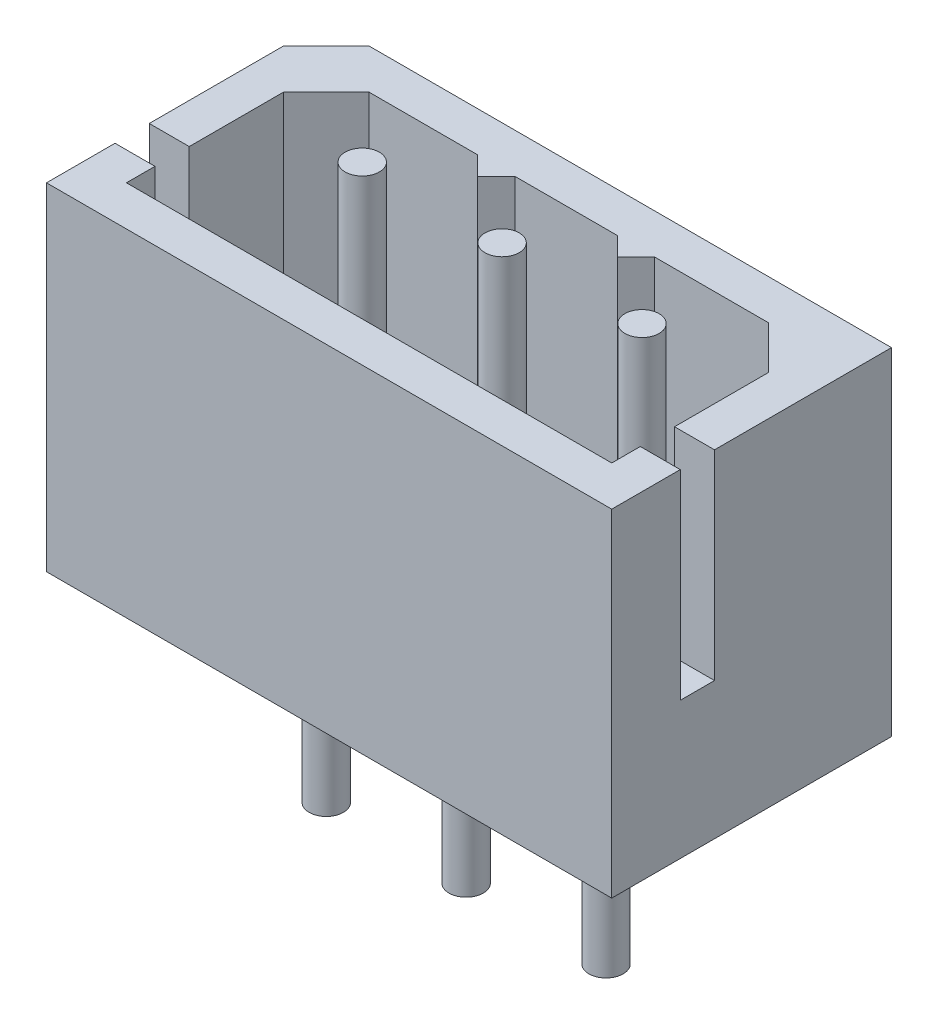
ISO-10303-21;
HEADER;
FILE_DESCRIPTION(('STEP AP214'),'2;1');
FILE_NAME('part.step','',(''),(''),'','','');
FILE_SCHEMA(('AUTOMOTIVE_DESIGN { 1 0 10303 214 1 1 1 1 }'));
ENDSEC;
DATA;
#1=APPLICATION_CONTEXT('core data for automotive mechanical design processes');
#2=APPLICATION_PROTOCOL_DEFINITION('international standard','automotive_design',2000,#1);
#3=PRODUCT_CONTEXT('',#1,'mechanical');
#4=PRODUCT('Part','Part','',(#3));
#5=PRODUCT_RELATED_PRODUCT_CATEGORY('part','',(#4));
#6=PRODUCT_DEFINITION_FORMATION('','',#4);
#7=PRODUCT_DEFINITION_CONTEXT('part definition',#1,'design');
#8=PRODUCT_DEFINITION('design','',#6,#7);
#9=PRODUCT_DEFINITION_SHAPE('','',#8);
#10=(LENGTH_UNIT() NAMED_UNIT(*) SI_UNIT(.MILLI.,.METRE.));
#11=(NAMED_UNIT(*) PLANE_ANGLE_UNIT() SI_UNIT($,.RADIAN.));
#12=(NAMED_UNIT(*) SI_UNIT($,.STERADIAN.) SOLID_ANGLE_UNIT());
#13=UNCERTAINTY_MEASURE_WITH_UNIT(LENGTH_MEASURE(1.E-05),#10,'distance_accuracy_value','');
#14=(GEOMETRIC_REPRESENTATION_CONTEXT(3) GLOBAL_UNCERTAINTY_ASSIGNED_CONTEXT((#13)) GLOBAL_UNIT_ASSIGNED_CONTEXT((#10,
#11,#12)) REPRESENTATION_CONTEXT('',''));
#15=CARTESIAN_POINT('',(0.,0.,0.));
#16=DIRECTION('',(0.,0.,1.));
#17=DIRECTION('',(1.,0.,0.));
#18=AXIS2_PLACEMENT_3D('',#15,#16,#17);
#19=CARTESIAN_POINT('',(-4.95,-5.9,-1.7));
#20=DIRECTION('',(-1.,0.,0.));
#21=DIRECTION('',(0.,0.,1.));
#22=AXIS2_PLACEMENT_3D('',#19,#20,#21);
#23=PLANE('',#22);
#24=DIRECTION('',(0.,0.,1.));
#25=VECTOR('',#24,1.);
#26=CARTESIAN_POINT('',(-4.95,0.,-1.7));
#27=LINE('',#26,#25);
#28=CARTESIAN_POINT('',(-4.95,0.,1.25));
#29=VERTEX_POINT('',#28);
#30=CARTESIAN_POINT('',(-4.95,0.,2.45));
#31=VERTEX_POINT('',#30);
#32=EDGE_CURVE('E139',#29,#31,#27,.T.);
#33=ORIENTED_EDGE('',*,*,#32,.F.);
#34=DIRECTION('',(0.,1.,0.));
#35=VECTOR('',#34,1.);
#36=CARTESIAN_POINT('',(-4.95,-3.5,1.25));
#37=LINE('',#36,#35);
#38=CARTESIAN_POINT('',(-4.95,-3.5,1.25));
#39=VERTEX_POINT('',#38);
#40=EDGE_CURVE('E251',#39,#29,#37,.T.);
#41=ORIENTED_EDGE('',*,*,#40,.F.);
#42=DIRECTION('',(0.,0.,1.));
#43=VECTOR('',#42,1.);
#44=CARTESIAN_POINT('',(-4.95,-3.5,0.));
#45=LINE('',#44,#43);
#46=CARTESIAN_POINT('',(-4.95,-3.5,0.65));
#47=VERTEX_POINT('',#46);
#48=EDGE_CURVE('E324',#47,#39,#45,.T.);
#49=ORIENTED_EDGE('',*,*,#48,.F.);
#50=DIRECTION('',(0.,1.,0.));
#51=VECTOR('',#50,1.);
#52=CARTESIAN_POINT('',(-4.95,-3.5,0.65));
#53=LINE('',#52,#51);
#54=CARTESIAN_POINT('',(-4.95,0.,0.65));
#55=VERTEX_POINT('',#54);
#56=EDGE_CURVE('E249',#47,#55,#53,.T.);
#57=ORIENTED_EDGE('',*,*,#56,.T.);
#58=CARTESIAN_POINT('',(-4.95,0.,-1.7));
#59=VERTEX_POINT('',#58);
#60=EDGE_CURVE('E107',#59,#55,#27,.T.);
#61=ORIENTED_EDGE('',*,*,#60,.F.);
#62=DIRECTION('',(0.,1.,0.));
#63=VECTOR('',#62,1.);
#64=CARTESIAN_POINT('',(-4.95,-5.9,-1.7));
#65=LINE('',#64,#63);
#66=CARTESIAN_POINT('',(-4.95,-5.9,-1.7));
#67=VERTEX_POINT('',#66);
#68=EDGE_CURVE('E99',#67,#59,#65,.T.);
#69=ORIENTED_EDGE('',*,*,#68,.F.);
#70=DIRECTION('',(0.,0.,1.));
#71=VECTOR('',#70,1.);
#72=CARTESIAN_POINT('',(-4.95,-5.9,-1.7));
#73=LINE('',#72,#71);
#74=CARTESIAN_POINT('',(-4.95,-5.9,2.45));
#75=VERTEX_POINT('',#74);
#76=EDGE_CURVE('E103',#67,#75,#73,.T.);
#77=ORIENTED_EDGE('',*,*,#76,.T.);
#78=DIRECTION('',(0.,1.,0.));
#79=VECTOR('',#78,1.);
#80=CARTESIAN_POINT('',(-4.95,-5.9,2.45));
#81=LINE('',#80,#79);
#82=EDGE_CURVE('E112',#75,#31,#81,.T.);
#83=ORIENTED_EDGE('',*,*,#82,.T.);
#84=EDGE_LOOP('',(#33,#41,#49,#57,#61,#69,#77,#83));
#85=FACE_BOUND('',#84,.T.);
#86=ADVANCED_FACE('F33',(#85),#23,.T.);
#87=CARTESIAN_POINT('',(0.,0.,0.));
#88=DIRECTION('',(0.,1.,0.));
#89=DIRECTION('',(0.,0.,1.));
#90=AXIS2_PLACEMENT_3D('',#87,#88,#89);
#91=PLANE('',#90);
#92=ORIENTED_EDGE('',*,*,#60,.T.);
#93=DIRECTION('',(1.,0.,0.));
#94=VECTOR('',#93,1.);
#95=CARTESIAN_POINT('',(0.,0.,0.649999999999981));
#96=LINE('',#95,#94);
#97=CARTESIAN_POINT('',(-4.25,0.,0.649999999999997));
#98=VERTEX_POINT('',#97);
#99=EDGE_CURVE('E271',#55,#98,#96,.T.);
#100=ORIENTED_EDGE('',*,*,#99,.T.);
#101=DIRECTION('',(0.,0.,1.));
#102=VECTOR('',#101,1.);
#103=CARTESIAN_POINT('',(-4.25,0.,0.));
#104=LINE('',#103,#102);
#105=CARTESIAN_POINT('',(-4.25,0.,-0.999999999999997));
#106=VERTEX_POINT('',#105);
#107=EDGE_CURVE('E274',#106,#98,#104,.T.);
#108=ORIENTED_EDGE('',*,*,#107,.F.);
#109=DIRECTION('',(-0.707106781186547,0.,0.707106781186548));
#110=VECTOR('',#109,1.);
#111=CARTESIAN_POINT('',(-2.625,0.,-2.625));
#112=LINE('',#111,#110);
#113=CARTESIAN_POINT('',(-3.5,0.,-1.75));
#114=VERTEX_POINT('',#113);
#115=EDGE_CURVE('E277',#114,#106,#112,.T.);
#116=ORIENTED_EDGE('',*,*,#115,.F.);
#117=DIRECTION('',(1.,0.,0.));
#118=VECTOR('',#117,1.);
#119=CARTESIAN_POINT('',(0.,0.,-1.75));
#120=LINE('',#119,#118);
#121=CARTESIAN_POINT('',(-1.60324749587586,0.,-1.75));
#122=VERTEX_POINT('',#121);
#123=EDGE_CURVE('E280',#114,#122,#120,.T.);
#124=ORIENTED_EDGE('',*,*,#123,.T.);
#125=DIRECTION('',(-0.707106781186551,0.,-0.707106781186544));
#126=VECTOR('',#125,1.);
#127=CARTESIAN_POINT('',(0.0733762520620777,0.,-0.0733762520620785));
#128=LINE('',#127,#126);
#129=CARTESIAN_POINT('',(-1.27500000000001,0.,-1.42175250412415));
#130=VERTEX_POINT('',#129);
#131=EDGE_CURVE('E281',#130,#122,#128,.T.);
#132=ORIENTED_EDGE('',*,*,#131,.F.);
#133=DIRECTION('',(0.707106781186546,0.,-0.707106781186549));
#134=VECTOR('',#133,1.);
#135=CARTESIAN_POINT('',(-1.34837625206208,0.,-1.34837625206207));
#136=LINE('',#135,#134);
#137=CARTESIAN_POINT('',(-0.946752504124156,0.,-1.75));
#138=VERTEX_POINT('',#137);
#139=EDGE_CURVE('E284',#130,#138,#136,.T.);
#140=ORIENTED_EDGE('',*,*,#139,.T.);
#141=CARTESIAN_POINT('',(0.846752504124141,0.,-1.75));
#142=VERTEX_POINT('',#141);
#143=EDGE_CURVE('E287',#138,#142,#120,.T.);
#144=ORIENTED_EDGE('',*,*,#143,.T.);
#145=DIRECTION('',(-0.707106781186551,0.,-0.707106781186544));
#146=VECTOR('',#145,1.);
#147=CARTESIAN_POINT('',(1.29837625206206,0.,-1.29837625206208));
#148=LINE('',#147,#146);
#149=CARTESIAN_POINT('',(1.175,0.,-1.42175250412415));
#150=VERTEX_POINT('',#149);
#151=EDGE_CURVE('E288',#150,#142,#148,.T.);
#152=ORIENTED_EDGE('',*,*,#151,.F.);
#153=DIRECTION('',(0.707106781186546,0.,-0.707106781186549));
#154=VECTOR('',#153,1.);
#155=CARTESIAN_POINT('',(-0.123376252062073,0.,-0.123376252062072));
#156=LINE('',#155,#154);
#157=CARTESIAN_POINT('',(1.50324749587584,0.,-1.75));
#158=VERTEX_POINT('',#157);
#159=EDGE_CURVE('E291',#150,#158,#156,.T.);
#160=ORIENTED_EDGE('',*,*,#159,.T.);
#161=CARTESIAN_POINT('',(3.5,0.,-1.75));
#162=VERTEX_POINT('',#161);
#163=EDGE_CURVE('E294',#158,#162,#120,.T.);
#164=ORIENTED_EDGE('',*,*,#163,.T.);
#165=DIRECTION('',(0.707106781186548,0.,0.707106781186547));
#166=VECTOR('',#165,1.);
#167=CARTESIAN_POINT('',(2.625,0.,-2.625));
#168=LINE('',#167,#166);
#169=CARTESIAN_POINT('',(4.25,0.,-0.999999999999997));
#170=VERTEX_POINT('',#169);
#171=EDGE_CURVE('E297',#162,#170,#168,.T.);
#172=ORIENTED_EDGE('',*,*,#171,.T.);
#173=DIRECTION('',(0.,0.,1.));
#174=VECTOR('',#173,1.);
#175=CARTESIAN_POINT('',(4.25,0.,0.));
#176=LINE('',#175,#174);
#177=CARTESIAN_POINT('',(4.25,0.,0.649999999999997));
#178=VERTEX_POINT('',#177);
#179=EDGE_CURVE('E300',#170,#178,#176,.T.);
#180=ORIENTED_EDGE('',*,*,#179,.T.);
#181=DIRECTION('',(-1.,0.,0.));
#182=VECTOR('',#181,1.);
#183=CARTESIAN_POINT('',(0.,0.,0.649999999999995));
#184=LINE('',#183,#182);
#185=CARTESIAN_POINT('',(4.95,0.,0.649999999999998));
#186=VERTEX_POINT('',#185);
#187=EDGE_CURVE('E191',#186,#178,#184,.T.);
#188=ORIENTED_EDGE('',*,*,#187,.F.);
#189=DIRECTION('',(0.,0.,-1.));
#190=VECTOR('',#189,1.);
#191=CARTESIAN_POINT('',(4.95,0.,-2.45));
#192=LINE('',#191,#190);
#193=CARTESIAN_POINT('',(4.95,0.,-2.45));
#194=VERTEX_POINT('',#193);
#195=EDGE_CURVE('E134',#186,#194,#192,.T.);
#196=ORIENTED_EDGE('',*,*,#195,.T.);
#197=DIRECTION('',(-1.,0.,0.));
#198=VECTOR('',#197,1.);
#199=CARTESIAN_POINT('',(-4.2,0.,-2.45));
#200=LINE('',#199,#198);
#201=CARTESIAN_POINT('',(-4.2,0.,-2.45));
#202=VERTEX_POINT('',#201);
#203=EDGE_CURVE('E133',#194,#202,#200,.T.);
#204=ORIENTED_EDGE('',*,*,#203,.T.);
#205=DIRECTION('',(-0.707106781186548,0.,0.707106781186547));
#206=VECTOR('',#205,1.);
#207=CARTESIAN_POINT('',(-4.2,0.,-2.45));
#208=LINE('',#207,#206);
#209=EDGE_CURVE('E137',#202,#59,#208,.T.);
#210=ORIENTED_EDGE('',*,*,#209,.T.);
#211=EDGE_LOOP('',(#92,#100,#108,#116,#124,#132,#140,#144,#152,#160,#164,#172,#180,#188,#196,
#204,#210));
#212=FACE_BOUND('',#211,.T.);
#213=ADVANCED_FACE('F163',(#212),#91,.T.);
#214=DIRECTION('',(0.,0.,1.));
#215=VECTOR('',#214,1.);
#216=CARTESIAN_POINT('',(-4.25000000000001,0.,0.));
#217=LINE('',#216,#215);
#218=CARTESIAN_POINT('',(-4.25,0.,1.25));
#219=VERTEX_POINT('',#218);
#220=CARTESIAN_POINT('',(-4.25,0.,1.75));
#221=VERTEX_POINT('',#220);
#222=EDGE_CURVE('E265',#219,#221,#217,.T.);
#223=ORIENTED_EDGE('',*,*,#222,.F.);
#224=DIRECTION('',(-1.,0.,0.));
#225=VECTOR('',#224,1.);
#226=CARTESIAN_POINT('',(0.,0.,1.24999999999998));
#227=LINE('',#226,#225);
#228=EDGE_CURVE('E268',#219,#29,#227,.T.);
#229=ORIENTED_EDGE('',*,*,#228,.T.);
#230=ORIENTED_EDGE('',*,*,#32,.T.);
#231=DIRECTION('',(1.,0.,0.));
#232=VECTOR('',#231,1.);
#233=CARTESIAN_POINT('',(-4.95,0.,2.45));
#234=LINE('',#233,#232);
#235=CARTESIAN_POINT('',(4.95,0.,2.45));
#236=VERTEX_POINT('',#235);
#237=EDGE_CURVE('E141',#31,#236,#234,.T.);
#238=ORIENTED_EDGE('',*,*,#237,.T.);
#239=CARTESIAN_POINT('',(4.95,0.,1.25));
#240=VERTEX_POINT('',#239);
#241=EDGE_CURVE('E130',#236,#240,#192,.T.);
#242=ORIENTED_EDGE('',*,*,#241,.T.);
#243=DIRECTION('',(1.,0.,0.));
#244=VECTOR('',#243,1.);
#245=CARTESIAN_POINT('',(0.,0.,1.24999999999999));
#246=LINE('',#245,#244);
#247=CARTESIAN_POINT('',(4.25,0.,1.25));
#248=VERTEX_POINT('',#247);
#249=EDGE_CURVE('E303',#248,#240,#246,.T.);
#250=ORIENTED_EDGE('',*,*,#249,.F.);
#251=DIRECTION('',(0.,0.,1.));
#252=VECTOR('',#251,1.);
#253=CARTESIAN_POINT('',(4.25000000000001,0.,0.));
#254=LINE('',#253,#252);
#255=CARTESIAN_POINT('',(4.25,0.,1.75));
#256=VERTEX_POINT('',#255);
#257=EDGE_CURVE('E48',#248,#256,#254,.T.);
#258=ORIENTED_EDGE('',*,*,#257,.T.);
#259=DIRECTION('',(1.,0.,0.));
#260=VECTOR('',#259,1.);
#261=CARTESIAN_POINT('',(0.,0.,1.75));
#262=LINE('',#261,#260);
#263=EDGE_CURVE('E261',#221,#256,#262,.T.);
#264=ORIENTED_EDGE('',*,*,#263,.F.);
#265=EDGE_LOOP('',(#223,#229,#230,#238,#242,#250,#258,#264));
#266=FACE_BOUND('',#265,.T.);
#267=ADVANCED_FACE('F156',(#266),#91,.T.);
#268=CARTESIAN_POINT('',(0.,-5.9,0.));
#269=DIRECTION('',(0.,1.,0.));
#270=DIRECTION('',(0.,0.,1.));
#271=AXIS2_PLACEMENT_3D('',#268,#269,#270);
#272=PLANE('',#271);
#273=CARTESIAN_POINT('',(-0.0500000000000079,-5.9,0.));
#274=DIRECTION('',(0.,1.,0.));
#275=DIRECTION('',(0.,0.,1.));
#276=AXIS2_PLACEMENT_3D('',#273,#274,#275);
#277=CIRCLE('',#276,0.3);
#278=CARTESIAN_POINT('',(-0.0500000000000079,-5.9,0.3));
#279=VERTEX_POINT('',#278);
#280=EDGE_CURVE('E41',#279,#279,#277,.F.);
#281=ORIENTED_EDGE('',*,*,#280,.F.);
#282=EDGE_LOOP('',(#281));
#283=FACE_BOUND('',#282,.T.);
#284=DIRECTION('',(0.,0.,-1.));
#285=VECTOR('',#284,1.);
#286=CARTESIAN_POINT('',(4.95,-5.9,-2.45));
#287=LINE('',#286,#285);
#288=CARTESIAN_POINT('',(4.95,-5.9,2.45));
#289=VERTEX_POINT('',#288);
#290=CARTESIAN_POINT('',(4.95,-5.9,-2.45));
#291=VERTEX_POINT('',#290);
#292=EDGE_CURVE('E125',#289,#291,#287,.T.);
#293=ORIENTED_EDGE('',*,*,#292,.F.);
#294=DIRECTION('',(1.,0.,0.));
#295=VECTOR('',#294,1.);
#296=CARTESIAN_POINT('',(-4.95,-5.9,2.45));
#297=LINE('',#296,#295);
#298=EDGE_CURVE('E120',#75,#289,#297,.T.);
#299=ORIENTED_EDGE('',*,*,#298,.F.);
#300=ORIENTED_EDGE('',*,*,#76,.F.);
#301=DIRECTION('',(-0.707106781186548,0.,0.707106781186547));
#302=VECTOR('',#301,1.);
#303=CARTESIAN_POINT('',(-4.2,-5.9,-2.45));
#304=LINE('',#303,#302);
#305=CARTESIAN_POINT('',(-4.2,-5.9,-2.45));
#306=VERTEX_POINT('',#305);
#307=EDGE_CURVE('E119',#306,#67,#304,.T.);
#308=ORIENTED_EDGE('',*,*,#307,.F.);
#309=DIRECTION('',(-1.,0.,0.));
#310=VECTOR('',#309,1.);
#311=CARTESIAN_POINT('',(-4.2,-5.9,-2.45));
#312=LINE('',#311,#310);
#313=EDGE_CURVE('E123',#291,#306,#312,.T.);
#314=ORIENTED_EDGE('',*,*,#313,.F.);
#315=EDGE_LOOP('',(#293,#299,#300,#308,#314));
#316=FACE_BOUND('',#315,.T.);
#317=CARTESIAN_POINT('',(-2.5,-5.9,0.));
#318=DIRECTION('',(0.,1.,0.));
#319=DIRECTION('',(0.,0.,1.));
#320=AXIS2_PLACEMENT_3D('',#317,#318,#319);
#321=CIRCLE('',#320,0.299999999999992);
#322=CARTESIAN_POINT('',(-2.5,-5.9,0.299999999999992));
#323=VERTEX_POINT('',#322);
#324=EDGE_CURVE('E145',#323,#323,#321,.F.);
#325=ORIENTED_EDGE('',*,*,#324,.F.);
#326=EDGE_LOOP('',(#325));
#327=FACE_BOUND('',#326,.T.);
#328=CARTESIAN_POINT('',(2.39999999999998,-5.9,0.));
#329=DIRECTION('',(0.,1.,0.));
#330=DIRECTION('',(0.,0.,1.));
#331=AXIS2_PLACEMENT_3D('',#328,#329,#330);
#332=CIRCLE('',#331,0.3);
#333=CARTESIAN_POINT('',(2.39999999999998,-5.9,0.3));
#334=VERTEX_POINT('',#333);
#335=EDGE_CURVE('E11',#334,#334,#332,.F.);
#336=ORIENTED_EDGE('',*,*,#335,.F.);
#337=EDGE_LOOP('',(#336));
#338=FACE_BOUND('',#337,.T.);
#339=ADVANCED_FACE('F117',(#283,#316,#327,#338),#272,.F.);
#340=CARTESIAN_POINT('',(4.95,-5.9,-2.45));
#341=DIRECTION('',(1.,0.,0.));
#342=DIRECTION('',(0.,0.,-1.));
#343=AXIS2_PLACEMENT_3D('',#340,#341,#342);
#344=PLANE('',#343);
#345=DIRECTION('',(0.,1.,0.));
#346=VECTOR('',#345,1.);
#347=CARTESIAN_POINT('',(4.95,-3.5,0.649999999999998));
#348=LINE('',#347,#346);
#349=CARTESIAN_POINT('',(4.95,-3.5,0.649999999999998));
#350=VERTEX_POINT('',#349);
#351=EDGE_CURVE('E210',#350,#186,#348,.T.);
#352=ORIENTED_EDGE('',*,*,#351,.F.);
#353=DIRECTION('',(0.,0.,-1.));
#354=VECTOR('',#353,1.);
#355=CARTESIAN_POINT('',(4.95,-3.5,0.));
#356=LINE('',#355,#354);
#357=CARTESIAN_POINT('',(4.95,-3.5,1.25));
#358=VERTEX_POINT('',#357);
#359=EDGE_CURVE('E362',#358,#350,#356,.T.);
#360=ORIENTED_EDGE('',*,*,#359,.F.);
#361=DIRECTION('',(0.,1.,0.));
#362=VECTOR('',#361,1.);
#363=CARTESIAN_POINT('',(4.95,-3.5,1.25));
#364=LINE('',#363,#362);
#365=EDGE_CURVE('E206',#358,#240,#364,.T.);
#366=ORIENTED_EDGE('',*,*,#365,.T.);
#367=ORIENTED_EDGE('',*,*,#241,.F.);
#368=DIRECTION('',(0.,1.,0.));
#369=VECTOR('',#368,1.);
#370=CARTESIAN_POINT('',(4.95,-5.9,2.45));
#371=LINE('',#370,#369);
#372=EDGE_CURVE('E57',#289,#236,#371,.T.);
#373=ORIENTED_EDGE('',*,*,#372,.F.);
#374=ORIENTED_EDGE('',*,*,#292,.T.);
#375=DIRECTION('',(0.,1.,0.));
#376=VECTOR('',#375,1.);
#377=CARTESIAN_POINT('',(4.95,-5.9,-2.45));
#378=LINE('',#377,#376);
#379=EDGE_CURVE('E88',#291,#194,#378,.T.);
#380=ORIENTED_EDGE('',*,*,#379,.T.);
#381=ORIENTED_EDGE('',*,*,#195,.F.);
#382=EDGE_LOOP('',(#352,#360,#366,#367,#373,#374,#380,#381));
#383=FACE_BOUND('',#382,.T.);
#384=ADVANCED_FACE('F35',(#383),#344,.T.);
#385=CARTESIAN_POINT('',(-4.95,-5.9,2.45));
#386=DIRECTION('',(0.,0.,1.));
#387=DIRECTION('',(1.,0.,0.));
#388=AXIS2_PLACEMENT_3D('',#385,#386,#387);
#389=PLANE('',#388);
#390=ORIENTED_EDGE('',*,*,#237,.F.);
#391=ORIENTED_EDGE('',*,*,#82,.F.);
#392=ORIENTED_EDGE('',*,*,#298,.T.);
#393=ORIENTED_EDGE('',*,*,#372,.T.);
#394=EDGE_LOOP('',(#390,#391,#392,#393));
#395=FACE_BOUND('',#394,.T.);
#396=ADVANCED_FACE('F162',(#395),#389,.T.);
#397=CARTESIAN_POINT('',(-4.2,-5.9,-2.45));
#398=DIRECTION('',(-0.707106781186547,0.,-0.707106781186548));
#399=DIRECTION('',(-0.707106781186548,0.,0.707106781186547));
#400=AXIS2_PLACEMENT_3D('',#397,#398,#399);
#401=PLANE('',#400);
#402=ORIENTED_EDGE('',*,*,#209,.F.);
#403=DIRECTION('',(0.,1.,0.));
#404=VECTOR('',#403,1.);
#405=CARTESIAN_POINT('',(-4.2,-5.9,-2.45));
#406=LINE('',#405,#404);
#407=EDGE_CURVE('E113',#306,#202,#406,.T.);
#408=ORIENTED_EDGE('',*,*,#407,.F.);
#409=ORIENTED_EDGE('',*,*,#307,.T.);
#410=ORIENTED_EDGE('',*,*,#68,.T.);
#411=EDGE_LOOP('',(#402,#408,#409,#410));
#412=FACE_BOUND('',#411,.T.);
#413=ADVANCED_FACE('F122',(#412),#401,.T.);
#414=CARTESIAN_POINT('',(-4.2,-5.9,-2.45));
#415=DIRECTION('',(0.,0.,-1.));
#416=DIRECTION('',(-1.,0.,0.));
#417=AXIS2_PLACEMENT_3D('',#414,#415,#416);
#418=PLANE('',#417);
#419=ORIENTED_EDGE('',*,*,#203,.F.);
#420=ORIENTED_EDGE('',*,*,#379,.F.);
#421=ORIENTED_EDGE('',*,*,#313,.T.);
#422=ORIENTED_EDGE('',*,*,#407,.T.);
#423=EDGE_LOOP('',(#419,#420,#421,#422));
#424=FACE_BOUND('',#423,.T.);
#425=ADVANCED_FACE('F178',(#424),#418,.T.);
#426=CARTESIAN_POINT('',(-2.5,-9.4,0.));
#427=DIRECTION('',(0.,1.,0.));
#428=DIRECTION('',(0.,0.,1.));
#429=AXIS2_PLACEMENT_3D('',#426,#427,#428);
#430=CYLINDRICAL_SURFACE('',#429,0.299999999999992);
#431=CARTESIAN_POINT('',(-2.5,-9.4,0.));
#432=DIRECTION('',(0.,-1.,0.));
#433=DIRECTION('',(0.,0.,-1.));
#434=AXIS2_PLACEMENT_3D('',#431,#432,#433);
#435=CIRCLE('',#434,0.299999999999992);
#436=CARTESIAN_POINT('',(-2.5,-9.4,-0.299999999999992));
#437=VERTEX_POINT('',#436);
#438=EDGE_CURVE('E193',#437,#437,#435,.T.);
#439=ORIENTED_EDGE('',*,*,#438,.F.);
#440=EDGE_LOOP('',(#439));
#441=FACE_BOUND('',#440,.T.);
#442=ORIENTED_EDGE('',*,*,#324,.T.);
#443=EDGE_LOOP('',(#442));
#444=FACE_BOUND('',#443,.T.);
#445=ADVANCED_FACE('F180',(#441,#444),#430,.T.);
#446=CARTESIAN_POINT('',(-2.5,-9.4,0.));
#447=DIRECTION('',(0.,-1.,0.));
#448=DIRECTION('',(0.,0.,-1.));
#449=AXIS2_PLACEMENT_3D('',#446,#447,#448);
#450=PLANE('',#449);
#451=ORIENTED_EDGE('',*,*,#438,.T.);
#452=EDGE_LOOP('',(#451));
#453=FACE_BOUND('',#452,.T.);
#454=ADVANCED_FACE('F184',(#453),#450,.T.);
#455=CARTESIAN_POINT('',(-0.0500000000000079,-9.4,0.));
#456=DIRECTION('',(0.,1.,0.));
#457=DIRECTION('',(0.,0.,1.));
#458=AXIS2_PLACEMENT_3D('',#455,#456,#457);
#459=CYLINDRICAL_SURFACE('',#458,0.3);
#460=CARTESIAN_POINT('',(-0.0500000000000079,-9.4,0.));
#461=DIRECTION('',(0.,-1.,0.));
#462=DIRECTION('',(0.,0.,-1.));
#463=AXIS2_PLACEMENT_3D('',#460,#461,#462);
#464=CIRCLE('',#463,0.3);
#465=CARTESIAN_POINT('',(-0.0500000000000079,-9.4,-0.3));
#466=VERTEX_POINT('',#465);
#467=EDGE_CURVE('E197',#466,#466,#464,.T.);
#468=ORIENTED_EDGE('',*,*,#467,.F.);
#469=EDGE_LOOP('',(#468));
#470=FACE_BOUND('',#469,.T.);
#471=ORIENTED_EDGE('',*,*,#280,.T.);
#472=EDGE_LOOP('',(#471));
#473=FACE_BOUND('',#472,.T.);
#474=ADVANCED_FACE('F153',(#470,#473),#459,.T.);
#475=CARTESIAN_POINT('',(-0.0500000000000079,-9.4,0.));
#476=DIRECTION('',(0.,-1.,0.));
#477=DIRECTION('',(0.,0.,-1.));
#478=AXIS2_PLACEMENT_3D('',#475,#476,#477);
#479=PLANE('',#478);
#480=ORIENTED_EDGE('',*,*,#467,.T.);
#481=EDGE_LOOP('',(#480));
#482=FACE_BOUND('',#481,.T.);
#483=ADVANCED_FACE('F511',(#482),#479,.T.);
#484=CARTESIAN_POINT('',(2.39999999999998,-9.4,0.));
#485=DIRECTION('',(0.,1.,0.));
#486=DIRECTION('',(0.,0.,1.));
#487=AXIS2_PLACEMENT_3D('',#484,#485,#486);
#488=CYLINDRICAL_SURFACE('',#487,0.3);
#489=CARTESIAN_POINT('',(2.39999999999998,-9.4,0.));
#490=DIRECTION('',(0.,-1.,0.));
#491=DIRECTION('',(0.,0.,-1.));
#492=AXIS2_PLACEMENT_3D('',#489,#490,#491);
#493=CIRCLE('',#492,0.3);
#494=CARTESIAN_POINT('',(2.39999999999998,-9.4,-0.3));
#495=VERTEX_POINT('',#494);
#496=EDGE_CURVE('E200',#495,#495,#493,.T.);
#497=ORIENTED_EDGE('',*,*,#496,.F.);
#498=EDGE_LOOP('',(#497));
#499=FACE_BOUND('',#498,.T.);
#500=ORIENTED_EDGE('',*,*,#335,.T.);
#501=EDGE_LOOP('',(#500));
#502=FACE_BOUND('',#501,.T.);
#503=ADVANCED_FACE('F507',(#499,#502),#488,.T.);
#504=CARTESIAN_POINT('',(2.39999999999998,-9.4,0.));
#505=DIRECTION('',(0.,-1.,0.));
#506=DIRECTION('',(0.,0.,-1.));
#507=AXIS2_PLACEMENT_3D('',#504,#505,#506);
#508=PLANE('',#507);
#509=ORIENTED_EDGE('',*,*,#496,.T.);
#510=EDGE_LOOP('',(#509));
#511=FACE_BOUND('',#510,.T.);
#512=ADVANCED_FACE('F495',(#511),#508,.T.);
#513=CARTESIAN_POINT('',(4.25000000000001,-3.5,0.));
#514=DIRECTION('',(-1.,0.,0.));
#515=DIRECTION('',(0.,0.,1.));
#516=AXIS2_PLACEMENT_3D('',#513,#514,#515);
#517=PLANE('',#516);
#518=ORIENTED_EDGE('',*,*,#257,.F.);
#519=DIRECTION('',(0.,1.,0.));
#520=VECTOR('',#519,1.);
#521=CARTESIAN_POINT('',(4.25,-3.5,1.25));
#522=LINE('',#521,#520);
#523=CARTESIAN_POINT('',(4.25,-3.5,1.25));
#524=VERTEX_POINT('',#523);
#525=EDGE_CURVE('E204',#524,#248,#522,.T.);
#526=ORIENTED_EDGE('',*,*,#525,.F.);
#527=DIRECTION('',(0.,0.,1.));
#528=VECTOR('',#527,1.);
#529=CARTESIAN_POINT('',(4.25000000000001,-3.5,0.));
#530=LINE('',#529,#528);
#531=CARTESIAN_POINT('',(4.25,-3.5,1.75));
#532=VERTEX_POINT('',#531);
#533=EDGE_CURVE('E368',#524,#532,#530,.T.);
#534=ORIENTED_EDGE('',*,*,#533,.T.);
#535=DIRECTION('',(0.,1.,0.));
#536=VECTOR('',#535,1.);
#537=CARTESIAN_POINT('',(4.25,-3.5,1.75));
#538=LINE('',#537,#536);
#539=EDGE_CURVE('E203',#532,#256,#538,.T.);
#540=ORIENTED_EDGE('',*,*,#539,.T.);
#541=EDGE_LOOP('',(#518,#526,#534,#540));
#542=FACE_BOUND('',#541,.T.);
#543=ADVANCED_FACE('F425',(#542),#517,.T.);
#544=CARTESIAN_POINT('',(0.,-3.5,1.75));
#545=DIRECTION('',(0.,0.,1.));
#546=DIRECTION('',(1.,0.,0.));
#547=AXIS2_PLACEMENT_3D('',#544,#545,#546);
#548=PLANE('',#547);
#549=ORIENTED_EDGE('',*,*,#263,.T.);
#550=ORIENTED_EDGE('',*,*,#539,.F.);
#551=DIRECTION('',(1.,0.,0.));
#552=VECTOR('',#551,1.);
#553=CARTESIAN_POINT('',(0.,-3.5,1.75));
#554=LINE('',#553,#552);
#555=CARTESIAN_POINT('',(-4.25,-3.5,1.75));
#556=VERTEX_POINT('',#555);
#557=EDGE_CURVE('E207',#556,#532,#554,.T.);
#558=ORIENTED_EDGE('',*,*,#557,.F.);
#559=DIRECTION('',(0.,1.,0.));
#560=VECTOR('',#559,1.);
#561=CARTESIAN_POINT('',(-4.25,-3.5,1.75));
#562=LINE('',#561,#560);
#563=EDGE_CURVE('E257',#556,#221,#562,.T.);
#564=ORIENTED_EDGE('',*,*,#563,.T.);
#565=EDGE_LOOP('',(#549,#550,#558,#564));
#566=FACE_BOUND('',#565,.T.);
#567=ADVANCED_FACE('F427',(#566),#548,.F.);
#568=CARTESIAN_POINT('',(-4.25000000000001,-3.5,0.));
#569=DIRECTION('',(-1.,0.,0.));
#570=DIRECTION('',(0.,0.,1.));
#571=AXIS2_PLACEMENT_3D('',#568,#569,#570);
#572=PLANE('',#571);
#573=ORIENTED_EDGE('',*,*,#222,.T.);
#574=ORIENTED_EDGE('',*,*,#563,.F.);
#575=DIRECTION('',(0.,0.,1.));
#576=VECTOR('',#575,1.);
#577=CARTESIAN_POINT('',(-4.25000000000001,-3.5,0.));
#578=LINE('',#577,#576);
#579=CARTESIAN_POINT('',(-4.25,-3.5,1.25));
#580=VERTEX_POINT('',#579);
#581=EDGE_CURVE('E318',#580,#556,#578,.T.);
#582=ORIENTED_EDGE('',*,*,#581,.F.);
#583=DIRECTION('',(0.,1.,0.));
#584=VECTOR('',#583,1.);
#585=CARTESIAN_POINT('',(-4.25,-3.5,1.25));
#586=LINE('',#585,#584);
#587=EDGE_CURVE('E254',#580,#219,#586,.T.);
#588=ORIENTED_EDGE('',*,*,#587,.T.);
#589=EDGE_LOOP('',(#573,#574,#582,#588));
#590=FACE_BOUND('',#589,.T.);
#591=ADVANCED_FACE('F429',(#590),#572,.F.);
#592=CARTESIAN_POINT('',(0.,-3.5,1.24999999999998));
#593=DIRECTION('',(0.,0.,-1.));
#594=DIRECTION('',(-1.,0.,0.));
#595=AXIS2_PLACEMENT_3D('',#592,#593,#594);
#596=PLANE('',#595);
#597=ORIENTED_EDGE('',*,*,#228,.F.);
#598=ORIENTED_EDGE('',*,*,#587,.F.);
#599=DIRECTION('',(-1.,0.,0.));
#600=VECTOR('',#599,1.);
#601=CARTESIAN_POINT('',(0.,-3.5,1.24999999999998));
#602=LINE('',#601,#600);
#603=EDGE_CURVE('E321',#580,#39,#602,.T.);
#604=ORIENTED_EDGE('',*,*,#603,.T.);
#605=ORIENTED_EDGE('',*,*,#40,.T.);
#606=EDGE_LOOP('',(#597,#598,#604,#605));
#607=FACE_BOUND('',#606,.T.);
#608=ADVANCED_FACE('F435',(#607),#596,.T.);
#609=CARTESIAN_POINT('',(0.,-3.5,0.649999999999981));
#610=DIRECTION('',(0.,0.,1.));
#611=DIRECTION('',(1.,0.,0.));
#612=AXIS2_PLACEMENT_3D('',#609,#610,#611);
#613=PLANE('',#612);
#614=ORIENTED_EDGE('',*,*,#99,.F.);
#615=ORIENTED_EDGE('',*,*,#56,.F.);
#616=DIRECTION('',(1.,0.,0.));
#617=VECTOR('',#616,1.);
#618=CARTESIAN_POINT('',(0.,-3.5,0.649999999999981));
#619=LINE('',#618,#617);
#620=CARTESIAN_POINT('',(-4.25,-3.5,0.649999999999997));
#621=VERTEX_POINT('',#620);
#622=EDGE_CURVE('E327',#47,#621,#619,.T.);
#623=ORIENTED_EDGE('',*,*,#622,.T.);
#624=DIRECTION('',(0.,1.,0.));
#625=VECTOR('',#624,1.);
#626=CARTESIAN_POINT('',(-4.25,-3.5,0.649999999999997));
#627=LINE('',#626,#625);
#628=EDGE_CURVE('E246',#621,#98,#627,.T.);
#629=ORIENTED_EDGE('',*,*,#628,.T.);
#630=EDGE_LOOP('',(#614,#615,#623,#629));
#631=FACE_BOUND('',#630,.T.);
#632=ADVANCED_FACE('F437',(#631),#613,.T.);
#633=CARTESIAN_POINT('',(-4.25,-3.5,0.));
#634=DIRECTION('',(-1.,0.,0.));
#635=DIRECTION('',(0.,0.,1.));
#636=AXIS2_PLACEMENT_3D('',#633,#634,#635);
#637=PLANE('',#636);
#638=ORIENTED_EDGE('',*,*,#107,.T.);
#639=ORIENTED_EDGE('',*,*,#628,.F.);
#640=DIRECTION('',(0.,0.,1.));
#641=VECTOR('',#640,1.);
#642=CARTESIAN_POINT('',(-4.25,-3.5,0.));
#643=LINE('',#642,#641);
#644=CARTESIAN_POINT('',(-4.25,-3.5,-0.999999999999997));
#645=VERTEX_POINT('',#644);
#646=EDGE_CURVE('E330',#645,#621,#643,.T.);
#647=ORIENTED_EDGE('',*,*,#646,.F.);
#648=DIRECTION('',(0.,1.,0.));
#649=VECTOR('',#648,1.);
#650=CARTESIAN_POINT('',(-4.25,-3.5,-0.999999999999997));
#651=LINE('',#650,#649);
#652=EDGE_CURVE('E243',#645,#106,#651,.T.);
#653=ORIENTED_EDGE('',*,*,#652,.T.);
#654=EDGE_LOOP('',(#638,#639,#647,#653));
#655=FACE_BOUND('',#654,.T.);
#656=ADVANCED_FACE('F443',(#655),#637,.F.);
#657=CARTESIAN_POINT('',(-2.625,-3.5,-2.625));
#658=DIRECTION('',(-0.707106781186548,0.,-0.707106781186547));
#659=DIRECTION('',(-0.707106781186547,0.,0.707106781186548));
#660=AXIS2_PLACEMENT_3D('',#657,#658,#659);
#661=PLANE('',#660);
#662=ORIENTED_EDGE('',*,*,#115,.T.);
#663=ORIENTED_EDGE('',*,*,#652,.F.);
#664=DIRECTION('',(-0.707106781186547,0.,0.707106781186548));
#665=VECTOR('',#664,1.);
#666=CARTESIAN_POINT('',(-2.625,-3.5,-2.625));
#667=LINE('',#666,#665);
#668=CARTESIAN_POINT('',(-3.5,-3.5,-1.75));
#669=VERTEX_POINT('',#668);
#670=EDGE_CURVE('E333',#669,#645,#667,.T.);
#671=ORIENTED_EDGE('',*,*,#670,.F.);
#672=DIRECTION('',(0.,1.,0.));
#673=VECTOR('',#672,1.);
#674=CARTESIAN_POINT('',(-3.5,-3.5,-1.75));
#675=LINE('',#674,#673);
#676=EDGE_CURVE('E240',#669,#114,#675,.T.);
#677=ORIENTED_EDGE('',*,*,#676,.T.);
#678=EDGE_LOOP('',(#662,#663,#671,#677));
#679=FACE_BOUND('',#678,.T.);
#680=ADVANCED_FACE('F451',(#679),#661,.F.);
#681=CARTESIAN_POINT('',(0.,-3.5,-1.75));
#682=DIRECTION('',(0.,0.,1.));
#683=DIRECTION('',(1.,0.,0.));
#684=AXIS2_PLACEMENT_3D('',#681,#682,#683);
#685=PLANE('',#684);
#686=ORIENTED_EDGE('',*,*,#123,.F.);
#687=ORIENTED_EDGE('',*,*,#676,.F.);
#688=DIRECTION('',(1.,0.,0.));
#689=VECTOR('',#688,1.);
#690=CARTESIAN_POINT('',(0.,-3.5,-1.75));
#691=LINE('',#690,#689);
#692=CARTESIAN_POINT('',(-1.60324749587586,-3.5,-1.75));
#693=VERTEX_POINT('',#692);
#694=EDGE_CURVE('E336',#669,#693,#691,.T.);
#695=ORIENTED_EDGE('',*,*,#694,.T.);
#696=DIRECTION('',(0.,1.,0.));
#697=VECTOR('',#696,1.);
#698=CARTESIAN_POINT('',(-1.60324749587586,-3.5,-1.75));
#699=LINE('',#698,#697);
#700=EDGE_CURVE('E237',#693,#122,#699,.T.);
#701=ORIENTED_EDGE('',*,*,#700,.T.);
#702=EDGE_LOOP('',(#686,#687,#695,#701));
#703=FACE_BOUND('',#702,.T.);
#704=ADVANCED_FACE('F455',(#703),#685,.T.);
#705=CARTESIAN_POINT('',(0.0733762520620777,-3.5,-0.0733762520620785));
#706=DIRECTION('',(0.707106781186544,0.,-0.707106781186551));
#707=DIRECTION('',(-0.707106781186551,0.,-0.707106781186544));
#708=AXIS2_PLACEMENT_3D('',#705,#706,#707);
#709=PLANE('',#708);
#710=ORIENTED_EDGE('',*,*,#131,.T.);
#711=ORIENTED_EDGE('',*,*,#700,.F.);
#712=DIRECTION('',(-0.707106781186551,0.,-0.707106781186544));
#713=VECTOR('',#712,1.);
#714=CARTESIAN_POINT('',(0.0733762520620777,-3.5,-0.0733762520620785));
#715=LINE('',#714,#713);
#716=CARTESIAN_POINT('',(-1.27500000000001,-3.5,-1.42175250412415));
#717=VERTEX_POINT('',#716);
#718=EDGE_CURVE('E337',#717,#693,#715,.T.);
#719=ORIENTED_EDGE('',*,*,#718,.F.);
#720=DIRECTION('',(0.,1.,0.));
#721=VECTOR('',#720,1.);
#722=CARTESIAN_POINT('',(-1.27500000000001,-3.5,-1.42175250412415));
#723=LINE('',#722,#721);
#724=EDGE_CURVE('E234',#717,#130,#723,.T.);
#725=ORIENTED_EDGE('',*,*,#724,.T.);
#726=EDGE_LOOP('',(#710,#711,#719,#725));
#727=FACE_BOUND('',#726,.T.);
#728=ADVANCED_FACE('F459',(#727),#709,.F.);
#729=CARTESIAN_POINT('',(-1.34837625206208,-3.5,-1.34837625206207));
#730=DIRECTION('',(0.707106781186549,0.,0.707106781186546));
#731=DIRECTION('',(0.707106781186546,0.,-0.707106781186549));
#732=AXIS2_PLACEMENT_3D('',#729,#730,#731);
#733=PLANE('',#732);
#734=ORIENTED_EDGE('',*,*,#139,.F.);
#735=ORIENTED_EDGE('',*,*,#724,.F.);
#736=DIRECTION('',(0.707106781186546,0.,-0.707106781186549));
#737=VECTOR('',#736,1.);
#738=CARTESIAN_POINT('',(-1.34837625206208,-3.5,-1.34837625206207));
#739=LINE('',#738,#737);
#740=CARTESIAN_POINT('',(-0.946752504124156,-3.5,-1.75));
#741=VERTEX_POINT('',#740);
#742=EDGE_CURVE('E340',#717,#741,#739,.T.);
#743=ORIENTED_EDGE('',*,*,#742,.T.);
#744=DIRECTION('',(0.,1.,0.));
#745=VECTOR('',#744,1.);
#746=CARTESIAN_POINT('',(-0.946752504124156,-3.5,-1.75));
#747=LINE('',#746,#745);
#748=EDGE_CURVE('E231',#741,#138,#747,.T.);
#749=ORIENTED_EDGE('',*,*,#748,.T.);
#750=EDGE_LOOP('',(#734,#735,#743,#749));
#751=FACE_BOUND('',#750,.T.);
#752=ADVANCED_FACE('F465',(#751),#733,.T.);
#753=ORIENTED_EDGE('',*,*,#143,.F.);
#754=ORIENTED_EDGE('',*,*,#748,.F.);
#755=CARTESIAN_POINT('',(0.846752504124141,-3.5,-1.75));
#756=VERTEX_POINT('',#755);
#757=EDGE_CURVE('E343',#741,#756,#691,.T.);
#758=ORIENTED_EDGE('',*,*,#757,.T.);
#759=DIRECTION('',(0.,1.,0.));
#760=VECTOR('',#759,1.);
#761=CARTESIAN_POINT('',(0.846752504124141,-3.5,-1.75));
#762=LINE('',#761,#760);
#763=EDGE_CURVE('E228',#756,#142,#762,.T.);
#764=ORIENTED_EDGE('',*,*,#763,.T.);
#765=EDGE_LOOP('',(#753,#754,#758,#764));
#766=FACE_BOUND('',#765,.T.);
#767=ADVANCED_FACE('F462',(#766),#685,.T.);
#768=CARTESIAN_POINT('',(1.29837625206206,-3.5,-1.29837625206208));
#769=DIRECTION('',(0.707106781186544,0.,-0.707106781186551));
#770=DIRECTION('',(-0.707106781186551,0.,-0.707106781186544));
#771=AXIS2_PLACEMENT_3D('',#768,#769,#770);
#772=PLANE('',#771);
#773=ORIENTED_EDGE('',*,*,#151,.T.);
#774=ORIENTED_EDGE('',*,*,#763,.F.);
#775=DIRECTION('',(-0.707106781186551,0.,-0.707106781186544));
#776=VECTOR('',#775,1.);
#777=CARTESIAN_POINT('',(1.29837625206206,-3.5,-1.29837625206208));
#778=LINE('',#777,#776);
#779=CARTESIAN_POINT('',(1.175,-3.5,-1.42175250412415));
#780=VERTEX_POINT('',#779);
#781=EDGE_CURVE('E344',#780,#756,#778,.T.);
#782=ORIENTED_EDGE('',*,*,#781,.F.);
#783=DIRECTION('',(0.,1.,0.));
#784=VECTOR('',#783,1.);
#785=CARTESIAN_POINT('',(1.175,-3.5,-1.42175250412415));
#786=LINE('',#785,#784);
#787=EDGE_CURVE('E225',#780,#150,#786,.T.);
#788=ORIENTED_EDGE('',*,*,#787,.T.);
#789=EDGE_LOOP('',(#773,#774,#782,#788));
#790=FACE_BOUND('',#789,.T.);
#791=ADVANCED_FACE('F470',(#790),#772,.F.);
#792=CARTESIAN_POINT('',(-0.123376252062073,-3.5,-0.123376252062072));
#793=DIRECTION('',(0.707106781186549,0.,0.707106781186546));
#794=DIRECTION('',(0.707106781186546,0.,-0.707106781186549));
#795=AXIS2_PLACEMENT_3D('',#792,#793,#794);
#796=PLANE('',#795);
#797=ORIENTED_EDGE('',*,*,#159,.F.);
#798=ORIENTED_EDGE('',*,*,#787,.F.);
#799=DIRECTION('',(0.707106781186546,0.,-0.707106781186549));
#800=VECTOR('',#799,1.);
#801=CARTESIAN_POINT('',(-0.123376252062073,-3.5,-0.123376252062072));
#802=LINE('',#801,#800);
#803=CARTESIAN_POINT('',(1.50324749587584,-3.5,-1.75));
#804=VERTEX_POINT('',#803);
#805=EDGE_CURVE('E347',#780,#804,#802,.T.);
#806=ORIENTED_EDGE('',*,*,#805,.T.);
#807=DIRECTION('',(0.,1.,0.));
#808=VECTOR('',#807,1.);
#809=CARTESIAN_POINT('',(1.50324749587584,-3.5,-1.75));
#810=LINE('',#809,#808);
#811=EDGE_CURVE('E222',#804,#158,#810,.T.);
#812=ORIENTED_EDGE('',*,*,#811,.T.);
#813=EDGE_LOOP('',(#797,#798,#806,#812));
#814=FACE_BOUND('',#813,.T.);
#815=ADVANCED_FACE('F473',(#814),#796,.T.);
#816=ORIENTED_EDGE('',*,*,#163,.F.);
#817=ORIENTED_EDGE('',*,*,#811,.F.);
#818=CARTESIAN_POINT('',(3.5,-3.5,-1.75));
#819=VERTEX_POINT('',#818);
#820=EDGE_CURVE('E350',#804,#819,#691,.T.);
#821=ORIENTED_EDGE('',*,*,#820,.T.);
#822=DIRECTION('',(0.,1.,0.));
#823=VECTOR('',#822,1.);
#824=CARTESIAN_POINT('',(3.5,-3.5,-1.75));
#825=LINE('',#824,#823);
#826=EDGE_CURVE('E219',#819,#162,#825,.T.);
#827=ORIENTED_EDGE('',*,*,#826,.T.);
#828=EDGE_LOOP('',(#816,#817,#821,#827));
#829=FACE_BOUND('',#828,.T.);
#830=ADVANCED_FACE('F461',(#829),#685,.T.);
#831=CARTESIAN_POINT('',(2.625,-3.5,-2.625));
#832=DIRECTION('',(-0.707106781186547,0.,0.707106781186548));
#833=DIRECTION('',(0.707106781186548,0.,0.707106781186547));
#834=AXIS2_PLACEMENT_3D('',#831,#832,#833);
#835=PLANE('',#834);
#836=ORIENTED_EDGE('',*,*,#171,.F.);
#837=ORIENTED_EDGE('',*,*,#826,.F.);
#838=DIRECTION('',(0.707106781186548,0.,0.707106781186547));
#839=VECTOR('',#838,1.);
#840=CARTESIAN_POINT('',(2.625,-3.5,-2.625));
#841=LINE('',#840,#839);
#842=CARTESIAN_POINT('',(4.25,-3.5,-0.999999999999997));
#843=VERTEX_POINT('',#842);
#844=EDGE_CURVE('E353',#819,#843,#841,.T.);
#845=ORIENTED_EDGE('',*,*,#844,.T.);
#846=DIRECTION('',(0.,1.,0.));
#847=VECTOR('',#846,1.);
#848=CARTESIAN_POINT('',(4.25,-3.5,-0.999999999999997));
#849=LINE('',#848,#847);
#850=EDGE_CURVE('E216',#843,#170,#849,.T.);
#851=ORIENTED_EDGE('',*,*,#850,.T.);
#852=EDGE_LOOP('',(#836,#837,#845,#851));
#853=FACE_BOUND('',#852,.T.);
#854=ADVANCED_FACE('F478',(#853),#835,.T.);
#855=CARTESIAN_POINT('',(4.25,-3.5,0.));
#856=DIRECTION('',(-1.,0.,0.));
#857=DIRECTION('',(0.,0.,1.));
#858=AXIS2_PLACEMENT_3D('',#855,#856,#857);
#859=PLANE('',#858);
#860=ORIENTED_EDGE('',*,*,#179,.F.);
#861=ORIENTED_EDGE('',*,*,#850,.F.);
#862=DIRECTION('',(0.,0.,1.));
#863=VECTOR('',#862,1.);
#864=CARTESIAN_POINT('',(4.25,-3.5,0.));
#865=LINE('',#864,#863);
#866=CARTESIAN_POINT('',(4.25,-3.5,0.649999999999997));
#867=VERTEX_POINT('',#866);
#868=EDGE_CURVE('E356',#843,#867,#865,.T.);
#869=ORIENTED_EDGE('',*,*,#868,.T.);
#870=DIRECTION('',(0.,1.,0.));
#871=VECTOR('',#870,1.);
#872=CARTESIAN_POINT('',(4.25,-3.5,0.649999999999997));
#873=LINE('',#872,#871);
#874=EDGE_CURVE('E213',#867,#178,#873,.T.);
#875=ORIENTED_EDGE('',*,*,#874,.T.);
#876=EDGE_LOOP('',(#860,#861,#869,#875));
#877=FACE_BOUND('',#876,.T.);
#878=ADVANCED_FACE('F481',(#877),#859,.T.);
#879=CARTESIAN_POINT('',(0.,-3.5,0.649999999999995));
#880=DIRECTION('',(0.,0.,-1.));
#881=DIRECTION('',(-1.,0.,0.));
#882=AXIS2_PLACEMENT_3D('',#879,#880,#881);
#883=PLANE('',#882);
#884=ORIENTED_EDGE('',*,*,#187,.T.);
#885=ORIENTED_EDGE('',*,*,#874,.F.);
#886=DIRECTION('',(-1.,0.,0.));
#887=VECTOR('',#886,1.);
#888=CARTESIAN_POINT('',(0.,-3.5,0.649999999999995));
#889=LINE('',#888,#887);
#890=EDGE_CURVE('E359',#350,#867,#889,.T.);
#891=ORIENTED_EDGE('',*,*,#890,.F.);
#892=ORIENTED_EDGE('',*,*,#351,.T.);
#893=EDGE_LOOP('',(#884,#885,#891,#892));
#894=FACE_BOUND('',#893,.T.);
#895=ADVANCED_FACE('F485',(#894),#883,.F.);
#896=CARTESIAN_POINT('',(-2.5,-3.5,-0.630000000000003));
#897=DIRECTION('',(0.,1.,0.));
#898=DIRECTION('',(0.,0.,1.));
#899=AXIS2_PLACEMENT_3D('',#896,#897,#898);
#900=CYLINDRICAL_SURFACE('',#899,0.3);
#901=CARTESIAN_POINT('',(-2.5,-3.5,-0.630000000000003));
#902=DIRECTION('',(0.,1.,0.));
#903=DIRECTION('',(0.,0.,1.));
#904=AXIS2_PLACEMENT_3D('',#901,#902,#903);
#905=CIRCLE('',#904,0.3);
#906=CARTESIAN_POINT('',(-2.5,-3.5,-0.330000000000002));
#907=VERTEX_POINT('',#906);
#908=EDGE_CURVE('E371',#907,#907,#905,.T.);
#909=ORIENTED_EDGE('',*,*,#908,.T.);
#910=EDGE_LOOP('',(#909));
#911=FACE_BOUND('',#910,.T.);
#912=CARTESIAN_POINT('',(-2.5,0.,-0.630000000000003));
#913=DIRECTION('',(0.,1.,0.));
#914=DIRECTION('',(0.,0.,1.));
#915=AXIS2_PLACEMENT_3D('',#912,#913,#914);
#916=CIRCLE('',#915,0.3);
#917=CARTESIAN_POINT('',(-2.5,0.,-0.330000000000002));
#918=VERTEX_POINT('',#917);
#919=EDGE_CURVE('E307',#918,#918,#916,.T.);
#920=ORIENTED_EDGE('',*,*,#919,.F.);
#921=EDGE_LOOP('',(#920));
#922=FACE_BOUND('',#921,.T.);
#923=ADVANCED_FACE('F489',(#911,#922),#900,.T.);
#924=CARTESIAN_POINT('',(-0.0500000000000036,-3.5,-0.630000000000003));
#925=DIRECTION('',(0.,1.,0.));
#926=DIRECTION('',(0.,0.,1.));
#927=AXIS2_PLACEMENT_3D('',#924,#925,#926);
#928=CYLINDRICAL_SURFACE('',#927,0.3);
#929=CARTESIAN_POINT('',(-0.0500000000000036,-3.5,-0.630000000000003));
#930=DIRECTION('',(0.,1.,0.));
#931=DIRECTION('',(0.,0.,1.));
#932=AXIS2_PLACEMENT_3D('',#929,#930,#931);
#933=CIRCLE('',#932,0.3);
#934=CARTESIAN_POINT('',(-0.0500000000000036,-3.5,-0.330000000000002));
#935=VERTEX_POINT('',#934);
#936=EDGE_CURVE('E374',#935,#935,#933,.T.);
#937=ORIENTED_EDGE('',*,*,#936,.T.);
#938=EDGE_LOOP('',(#937));
#939=FACE_BOUND('',#938,.T.);
#940=CARTESIAN_POINT('',(-0.0500000000000036,0.,-0.630000000000003));
#941=DIRECTION('',(0.,1.,0.));
#942=DIRECTION('',(0.,0.,1.));
#943=AXIS2_PLACEMENT_3D('',#940,#941,#942);
#944=CIRCLE('',#943,0.3);
#945=CARTESIAN_POINT('',(-0.0500000000000036,0.,-0.330000000000002));
#946=VERTEX_POINT('',#945);
#947=EDGE_CURVE('E310',#946,#946,#944,.T.);
#948=ORIENTED_EDGE('',*,*,#947,.F.);
#949=EDGE_LOOP('',(#948));
#950=FACE_BOUND('',#949,.T.);
#951=ADVANCED_FACE('F498',(#939,#950),#928,.T.);
#952=CARTESIAN_POINT('',(2.4,-3.5,-0.630000000000003));
#953=DIRECTION('',(0.,1.,0.));
#954=DIRECTION('',(0.,0.,1.));
#955=AXIS2_PLACEMENT_3D('',#952,#953,#954);
#956=CYLINDRICAL_SURFACE('',#955,0.3);
#957=CARTESIAN_POINT('',(2.4,-3.5,-0.630000000000003));
#958=DIRECTION('',(0.,1.,0.));
#959=DIRECTION('',(0.,0.,1.));
#960=AXIS2_PLACEMENT_3D('',#957,#958,#959);
#961=CIRCLE('',#960,0.3);
#962=CARTESIAN_POINT('',(2.4,-3.5,-0.330000000000002));
#963=VERTEX_POINT('',#962);
#964=EDGE_CURVE('E264',#963,#963,#961,.T.);
#965=ORIENTED_EDGE('',*,*,#964,.T.);
#966=EDGE_LOOP('',(#965));
#967=FACE_BOUND('',#966,.T.);
#968=CARTESIAN_POINT('',(2.4,0.,-0.630000000000003));
#969=DIRECTION('',(0.,1.,0.));
#970=DIRECTION('',(0.,0.,1.));
#971=AXIS2_PLACEMENT_3D('',#968,#969,#970);
#972=CIRCLE('',#971,0.3);
#973=CARTESIAN_POINT('',(2.4,0.,-0.330000000000002));
#974=VERTEX_POINT('',#973);
#975=EDGE_CURVE('E313',#974,#974,#972,.T.);
#976=ORIENTED_EDGE('',*,*,#975,.F.);
#977=EDGE_LOOP('',(#976));
#978=FACE_BOUND('',#977,.T.);
#979=ADVANCED_FACE('F380',(#967,#978),#956,.T.);
#980=CARTESIAN_POINT('',(0.,-3.5,1.24999999999999));
#981=DIRECTION('',(0.,0.,1.));
#982=DIRECTION('',(1.,0.,0.));
#983=AXIS2_PLACEMENT_3D('',#980,#981,#982);
#984=PLANE('',#983);
#985=ORIENTED_EDGE('',*,*,#249,.T.);
#986=ORIENTED_EDGE('',*,*,#365,.F.);
#987=DIRECTION('',(1.,0.,0.));
#988=VECTOR('',#987,1.);
#989=CARTESIAN_POINT('',(0.,-3.5,1.24999999999999));
#990=LINE('',#989,#988);
#991=EDGE_CURVE('E365',#524,#358,#990,.T.);
#992=ORIENTED_EDGE('',*,*,#991,.F.);
#993=ORIENTED_EDGE('',*,*,#525,.T.);
#994=EDGE_LOOP('',(#985,#986,#992,#993));
#995=FACE_BOUND('',#994,.T.);
#996=ADVANCED_FACE('F386',(#995),#984,.F.);
#997=CARTESIAN_POINT('',(0.,-3.5,0.));
#998=DIRECTION('',(0.,1.,0.));
#999=DIRECTION('',(0.,0.,1.));
#1000=AXIS2_PLACEMENT_3D('',#997,#998,#999);
#1001=PLANE('',#1000);
#1002=ORIENTED_EDGE('',*,*,#964,.F.);
#1003=EDGE_LOOP('',(#1002));
#1004=FACE_BOUND('',#1003,.T.);
#1005=ORIENTED_EDGE('',*,*,#936,.F.);
#1006=EDGE_LOOP('',(#1005));
#1007=FACE_BOUND('',#1006,.T.);
#1008=ORIENTED_EDGE('',*,*,#908,.F.);
#1009=EDGE_LOOP('',(#1008));
#1010=FACE_BOUND('',#1009,.T.);
#1011=ORIENTED_EDGE('',*,*,#533,.F.);
#1012=ORIENTED_EDGE('',*,*,#991,.T.);
#1013=ORIENTED_EDGE('',*,*,#359,.T.);
#1014=ORIENTED_EDGE('',*,*,#890,.T.);
#1015=ORIENTED_EDGE('',*,*,#868,.F.);
#1016=ORIENTED_EDGE('',*,*,#844,.F.);
#1017=ORIENTED_EDGE('',*,*,#820,.F.);
#1018=ORIENTED_EDGE('',*,*,#805,.F.);
#1019=ORIENTED_EDGE('',*,*,#781,.T.);
#1020=ORIENTED_EDGE('',*,*,#757,.F.);
#1021=ORIENTED_EDGE('',*,*,#742,.F.);
#1022=ORIENTED_EDGE('',*,*,#718,.T.);
#1023=ORIENTED_EDGE('',*,*,#694,.F.);
#1024=ORIENTED_EDGE('',*,*,#670,.T.);
#1025=ORIENTED_EDGE('',*,*,#646,.T.);
#1026=ORIENTED_EDGE('',*,*,#622,.F.);
#1027=ORIENTED_EDGE('',*,*,#48,.T.);
#1028=ORIENTED_EDGE('',*,*,#603,.F.);
#1029=ORIENTED_EDGE('',*,*,#581,.T.);
#1030=ORIENTED_EDGE('',*,*,#557,.T.);
#1031=EDGE_LOOP('',(#1011,#1012,#1013,#1014,#1015,#1016,#1017,#1018,#1019,#1020,#1021,#1022,
#1023,#1024,#1025,#1026,#1027,#1028,#1029,#1030));
#1032=FACE_BOUND('',#1031,.T.);
#1033=ADVANCED_FACE('F383',(#1004,#1007,#1010,#1032),#1001,.T.);
#1034=ORIENTED_EDGE('',*,*,#975,.T.);
#1035=EDGE_LOOP('',(#1034));
#1036=FACE_BOUND('',#1035,.T.);
#1037=ADVANCED_FACE('F166',(#1036),#91,.T.);
#1038=ORIENTED_EDGE('',*,*,#947,.T.);
#1039=EDGE_LOOP('',(#1038));
#1040=FACE_BOUND('',#1039,.T.);
#1041=ADVANCED_FACE('F686',(#1040),#91,.T.);
#1042=ORIENTED_EDGE('',*,*,#919,.T.);
#1043=EDGE_LOOP('',(#1042));
#1044=FACE_BOUND('',#1043,.T.);
#1045=ADVANCED_FACE('F174',(#1044),#91,.T.);
#1046=CLOSED_SHELL('',(#86,#213,#267,#339,#384,#396,#413,#425,#445,#454,#474,#483,#503,#512,
#543,#567,#591,#608,#632,#656,#680,#704,#728,#752,#767,#791,#815,#830,#854,#878,#895,#923,#951,
#979,#996,#1033,#1037,#1041,#1045));
#1047=MANIFOLD_SOLID_BREP('B2',#1046);
#1048=ADVANCED_BREP_SHAPE_REPRESENTATION('',(#18,#1047),#14);
#1049=SHAPE_DEFINITION_REPRESENTATION(#9,#1048);
ENDSEC;
END-ISO-10303-21;
